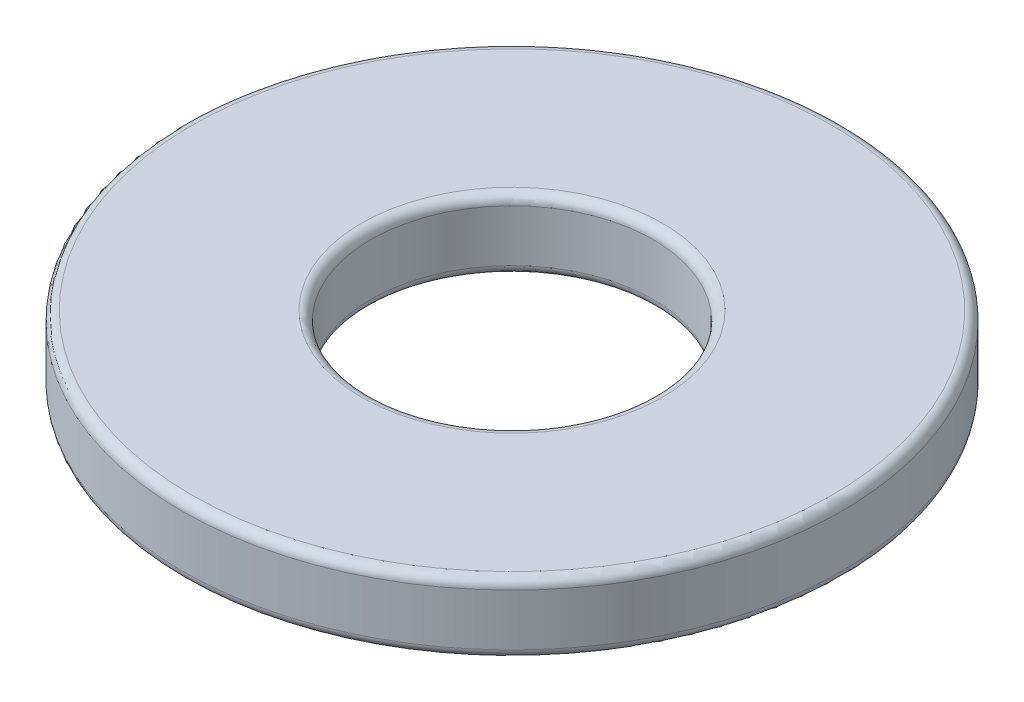
ISO-10303-21;
HEADER;
FILE_DESCRIPTION(('STEP AP214'),'2;1');
FILE_NAME('part.step','',(''),(''),'','','');
FILE_SCHEMA(('AUTOMOTIVE_DESIGN { 1 0 10303 214 1 1 1 1 }'));
ENDSEC;
DATA;
#1=APPLICATION_CONTEXT('core data for automotive mechanical design processes');
#2=APPLICATION_PROTOCOL_DEFINITION('international standard','automotive_design',2000,#1);
#3=PRODUCT_CONTEXT('',#1,'mechanical');
#4=PRODUCT('Part','Part','',(#3));
#5=PRODUCT_RELATED_PRODUCT_CATEGORY('part','',(#4));
#6=PRODUCT_DEFINITION_FORMATION('','',#4);
#7=PRODUCT_DEFINITION_CONTEXT('part definition',#1,'design');
#8=PRODUCT_DEFINITION('design','',#6,#7);
#9=PRODUCT_DEFINITION_SHAPE('','',#8);
#10=(LENGTH_UNIT() NAMED_UNIT(*) SI_UNIT(.MILLI.,.METRE.));
#11=(NAMED_UNIT(*) PLANE_ANGLE_UNIT() SI_UNIT($,.RADIAN.));
#12=(NAMED_UNIT(*) SI_UNIT($,.STERADIAN.) SOLID_ANGLE_UNIT());
#13=UNCERTAINTY_MEASURE_WITH_UNIT(LENGTH_MEASURE(1.E-05),#10,'distance_accuracy_value','');
#14=(GEOMETRIC_REPRESENTATION_CONTEXT(3) GLOBAL_UNCERTAINTY_ASSIGNED_CONTEXT((#13)) GLOBAL_UNIT_ASSIGNED_CONTEXT((#10,
#11,#12)) REPRESENTATION_CONTEXT('',''));
#15=CARTESIAN_POINT('',(0.,0.,0.));
#16=DIRECTION('',(0.,0.,1.));
#17=DIRECTION('',(1.,0.,0.));
#18=AXIS2_PLACEMENT_3D('',#15,#16,#17);
#19=CARTESIAN_POINT('',(0.,0.75,0.));
#20=DIRECTION('',(0.,1.,0.));
#21=DIRECTION('',(0.,0.,1.));
#22=AXIS2_PLACEMENT_3D('',#19,#20,#21);
#23=PLANE('',#22);
#24=CARTESIAN_POINT('',(0.,0.75,0.));
#25=DIRECTION('',(0.,1.,0.));
#26=DIRECTION('',(0.,0.,1.));
#27=AXIS2_PLACEMENT_3D('',#24,#25,#26);
#28=CIRCLE('',#27,1.6);
#29=CARTESIAN_POINT('',(0.,0.75,1.6));
#30=VERTEX_POINT('',#29);
#31=EDGE_CURVE('E42',#30,#30,#28,.F.);
#32=ORIENTED_EDGE('',*,*,#31,.T.);
#33=EDGE_LOOP('',(#32));
#34=FACE_BOUND('',#33,.T.);
#35=CARTESIAN_POINT('',(0.,0.75,0.));
#36=DIRECTION('',(0.,1.,0.));
#37=DIRECTION('',(0.,0.,1.));
#38=AXIS2_PLACEMENT_3D('',#35,#36,#37);
#39=CIRCLE('',#38,3.4);
#40=CARTESIAN_POINT('',(0.,0.75,3.4));
#41=VERTEX_POINT('',#40);
#42=EDGE_CURVE('E46',#41,#41,#39,.T.);
#43=ORIENTED_EDGE('',*,*,#42,.T.);
#44=EDGE_LOOP('',(#43));
#45=FACE_BOUND('',#44,.T.);
#46=ADVANCED_FACE('F31',(#34,#45),#23,.T.);
#47=CARTESIAN_POINT('',(0.,0.,0.));
#48=DIRECTION('',(0.,1.,0.));
#49=DIRECTION('',(0.,0.,1.));
#50=AXIS2_PLACEMENT_3D('',#47,#48,#49);
#51=PLANE('',#50);
#52=CARTESIAN_POINT('',(0.,0.,0.));
#53=DIRECTION('',(0.,1.,0.));
#54=DIRECTION('',(0.,0.,1.));
#55=AXIS2_PLACEMENT_3D('',#52,#53,#54);
#56=CIRCLE('',#55,1.6);
#57=CARTESIAN_POINT('',(0.,0.,1.6));
#58=VERTEX_POINT('',#57);
#59=EDGE_CURVE('E57',#58,#58,#56,.T.);
#60=ORIENTED_EDGE('',*,*,#59,.T.);
#61=EDGE_LOOP('',(#60));
#62=FACE_BOUND('',#61,.T.);
#63=CARTESIAN_POINT('',(0.,0.,0.));
#64=DIRECTION('',(0.,1.,0.));
#65=DIRECTION('',(0.,0.,1.));
#66=AXIS2_PLACEMENT_3D('',#63,#64,#65);
#67=CIRCLE('',#66,3.4);
#68=CARTESIAN_POINT('',(0.,0.,3.4));
#69=VERTEX_POINT('',#68);
#70=EDGE_CURVE('E60',#69,#69,#67,.F.);
#71=ORIENTED_EDGE('',*,*,#70,.T.);
#72=EDGE_LOOP('',(#71));
#73=FACE_BOUND('',#72,.T.);
#74=ADVANCED_FACE('F64',(#62,#73),#51,.F.);
#75=CARTESIAN_POINT('',(0.,0.75,0.));
#76=DIRECTION('',(0.,-1.,0.));
#77=DIRECTION('',(0.,0.,-1.));
#78=AXIS2_PLACEMENT_3D('',#75,#76,#77);
#79=CYLINDRICAL_SURFACE('',#78,3.5);
#80=CARTESIAN_POINT('',(0.,0.1,0.));
#81=DIRECTION('',(0.,1.,0.));
#82=DIRECTION('',(0.,0.,1.));
#83=AXIS2_PLACEMENT_3D('',#80,#81,#82);
#84=CIRCLE('',#83,3.5);
#85=CARTESIAN_POINT('',(0.,0.1,3.5));
#86=VERTEX_POINT('',#85);
#87=EDGE_CURVE('E10',#86,#86,#84,.T.);
#88=ORIENTED_EDGE('',*,*,#87,.T.);
#89=EDGE_LOOP('',(#88));
#90=FACE_BOUND('',#89,.T.);
#91=CARTESIAN_POINT('',(0.,0.65,0.));
#92=DIRECTION('',(0.,1.,0.));
#93=DIRECTION('',(0.,0.,1.));
#94=AXIS2_PLACEMENT_3D('',#91,#92,#93);
#95=CIRCLE('',#94,3.5);
#96=CARTESIAN_POINT('',(0.,0.65,3.5));
#97=VERTEX_POINT('',#96);
#98=EDGE_CURVE('E38',#97,#97,#95,.F.);
#99=ORIENTED_EDGE('',*,*,#98,.T.);
#100=EDGE_LOOP('',(#99));
#101=FACE_BOUND('',#100,.T.);
#102=ADVANCED_FACE('F84',(#90,#101),#79,.T.);
#103=CARTESIAN_POINT('',(0.,0.75,0.));
#104=DIRECTION('',(0.,-1.,0.));
#105=DIRECTION('',(0.,0.,-1.));
#106=AXIS2_PLACEMENT_3D('',#103,#104,#105);
#107=CYLINDRICAL_SURFACE('',#106,1.5);
#108=CARTESIAN_POINT('',(0.,0.1,0.));
#109=DIRECTION('',(0.,1.,0.));
#110=DIRECTION('',(0.,0.,1.));
#111=AXIS2_PLACEMENT_3D('',#108,#109,#110);
#112=CIRCLE('',#111,1.5);
#113=CARTESIAN_POINT('',(0.,0.1,1.5));
#114=VERTEX_POINT('',#113);
#115=EDGE_CURVE('E51',#114,#114,#112,.F.);
#116=ORIENTED_EDGE('',*,*,#115,.T.);
#117=EDGE_LOOP('',(#116));
#118=FACE_BOUND('',#117,.T.);
#119=CARTESIAN_POINT('',(0.,0.65,0.));
#120=DIRECTION('',(0.,1.,0.));
#121=DIRECTION('',(0.,0.,1.));
#122=AXIS2_PLACEMENT_3D('',#119,#120,#121);
#123=CIRCLE('',#122,1.5);
#124=CARTESIAN_POINT('',(0.,0.65,1.5));
#125=VERTEX_POINT('',#124);
#126=EDGE_CURVE('E54',#125,#125,#123,.T.);
#127=ORIENTED_EDGE('',*,*,#126,.T.);
#128=EDGE_LOOP('',(#127));
#129=FACE_BOUND('',#128,.T.);
#130=ADVANCED_FACE('F89',(#118,#129),#107,.F.);
#131=CARTESIAN_POINT('',(0.,0.1,0.));
#132=DIRECTION('',(0.,1.,0.));
#133=DIRECTION('',(0.,0.,1.));
#134=AXIS2_PLACEMENT_3D('',#131,#132,#133);
#135=TOROIDAL_SURFACE('',#134,1.6,0.1);
#136=ORIENTED_EDGE('',*,*,#115,.F.);
#137=EDGE_LOOP('',(#136));
#138=FACE_BOUND('',#137,.T.);
#139=ORIENTED_EDGE('',*,*,#59,.F.);
#140=EDGE_LOOP('',(#139));
#141=FACE_BOUND('',#140,.T.);
#142=ADVANCED_FACE('F75',(#138,#141),#135,.T.);
#143=CARTESIAN_POINT('',(0.,0.65,0.));
#144=DIRECTION('',(0.,1.,0.));
#145=DIRECTION('',(0.,0.,1.));
#146=AXIS2_PLACEMENT_3D('',#143,#144,#145);
#147=TOROIDAL_SURFACE('',#146,1.6,0.1);
#148=ORIENTED_EDGE('',*,*,#31,.F.);
#149=EDGE_LOOP('',(#148));
#150=FACE_BOUND('',#149,.T.);
#151=ORIENTED_EDGE('',*,*,#126,.F.);
#152=EDGE_LOOP('',(#151));
#153=FACE_BOUND('',#152,.T.);
#154=ADVANCED_FACE('F69',(#150,#153),#147,.T.);
#155=CARTESIAN_POINT('',(0.,0.1,0.));
#156=DIRECTION('',(0.,1.,0.));
#157=DIRECTION('',(0.,0.,1.));
#158=AXIS2_PLACEMENT_3D('',#155,#156,#157);
#159=TOROIDAL_SURFACE('',#158,3.4,0.1);
#160=ORIENTED_EDGE('',*,*,#70,.F.);
#161=EDGE_LOOP('',(#160));
#162=FACE_BOUND('',#161,.T.);
#163=ORIENTED_EDGE('',*,*,#87,.F.);
#164=EDGE_LOOP('',(#163));
#165=FACE_BOUND('',#164,.T.);
#166=ADVANCED_FACE('F66',(#162,#165),#159,.T.);
#167=CARTESIAN_POINT('',(0.,0.65,0.));
#168=DIRECTION('',(0.,1.,0.));
#169=DIRECTION('',(0.,0.,1.));
#170=AXIS2_PLACEMENT_3D('',#167,#168,#169);
#171=TOROIDAL_SURFACE('',#170,3.4,0.1);
#172=ORIENTED_EDGE('',*,*,#98,.F.);
#173=EDGE_LOOP('',(#172));
#174=FACE_BOUND('',#173,.T.);
#175=ORIENTED_EDGE('',*,*,#42,.F.);
#176=EDGE_LOOP('',(#175));
#177=FACE_BOUND('',#176,.T.);
#178=ADVANCED_FACE('F33',(#174,#177),#171,.T.);
#179=CLOSED_SHELL('',(#46,#74,#102,#130,#142,#154,#166,#178));
#180=MANIFOLD_SOLID_BREP('B2',#179);
#181=ADVANCED_BREP_SHAPE_REPRESENTATION('',(#18,#180),#14);
#182=SHAPE_DEFINITION_REPRESENTATION(#9,#181);
ENDSEC;
END-ISO-10303-21;
